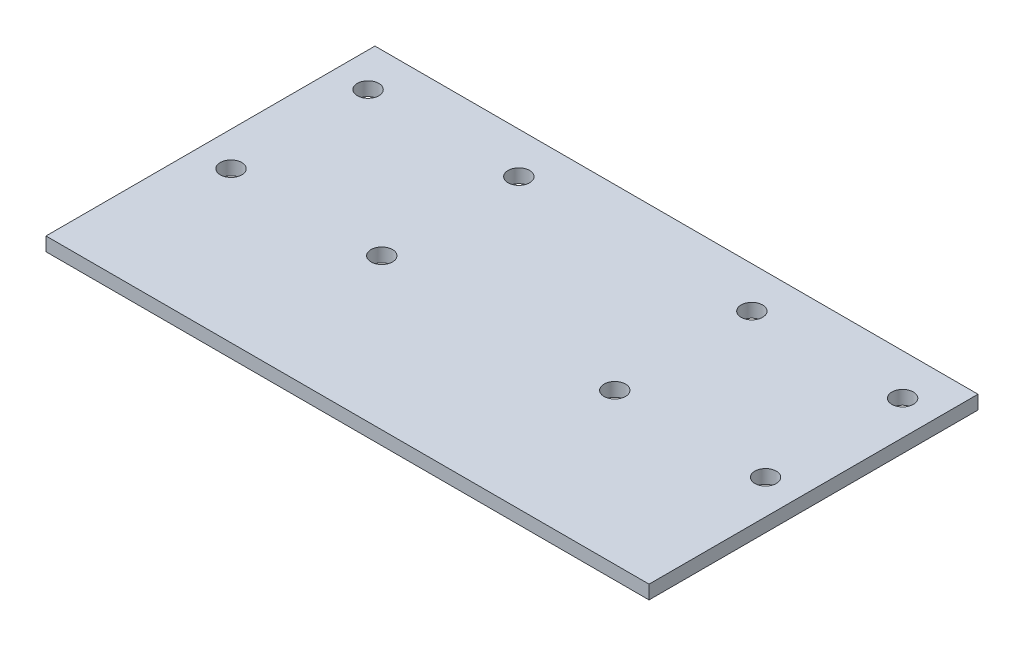
ISO-10303-21;
HEADER;
FILE_DESCRIPTION(('STEP AP214'),'2;1');
FILE_NAME('part.step','',(''),(''),'','','');
FILE_SCHEMA(('AUTOMOTIVE_DESIGN { 1 0 10303 214 1 1 1 1 }'));
ENDSEC;
DATA;
#1=APPLICATION_CONTEXT('core data for automotive mechanical design processes');
#2=APPLICATION_PROTOCOL_DEFINITION('international standard','automotive_design',2000,#1);
#3=PRODUCT_CONTEXT('',#1,'mechanical');
#4=PRODUCT('Part','Part','',(#3));
#5=PRODUCT_RELATED_PRODUCT_CATEGORY('part','',(#4));
#6=PRODUCT_DEFINITION_FORMATION('','',#4);
#7=PRODUCT_DEFINITION_CONTEXT('part definition',#1,'design');
#8=PRODUCT_DEFINITION('design','',#6,#7);
#9=PRODUCT_DEFINITION_SHAPE('','',#8);
#10=(LENGTH_UNIT() NAMED_UNIT(*) SI_UNIT(.MILLI.,.METRE.));
#11=(NAMED_UNIT(*) PLANE_ANGLE_UNIT() SI_UNIT($,.RADIAN.));
#12=(NAMED_UNIT(*) SI_UNIT($,.STERADIAN.) SOLID_ANGLE_UNIT());
#13=UNCERTAINTY_MEASURE_WITH_UNIT(LENGTH_MEASURE(1.E-05),#10,'distance_accuracy_value','');
#14=(GEOMETRIC_REPRESENTATION_CONTEXT(3) GLOBAL_UNCERTAINTY_ASSIGNED_CONTEXT((#13)) GLOBAL_UNIT_ASSIGNED_CONTEXT((#10,
#11,#12)) REPRESENTATION_CONTEXT('',''));
#15=CARTESIAN_POINT('',(0.,0.,0.));
#16=DIRECTION('',(0.,0.,1.));
#17=DIRECTION('',(1.,0.,0.));
#18=AXIS2_PLACEMENT_3D('',#15,#16,#17);
#19=CARTESIAN_POINT('',(0.,3.175,0.));
#20=DIRECTION('',(0.,-1.,0.));
#21=DIRECTION('',(0.,0.,-1.));
#22=AXIS2_PLACEMENT_3D('',#19,#20,#21);
#23=PLANE('',#22);
#24=CARTESIAN_POINT('',(-61.9125,3.175,-28.575));
#25=DIRECTION('',(0.,1.,0.));
#26=DIRECTION('',(0.,0.,1.));
#27=AXIS2_PLACEMENT_3D('',#24,#25,#26);
#28=CIRCLE('',#27,2.4892);
#29=CARTESIAN_POINT('',(-61.9125,3.175,-26.0858));
#30=VERTEX_POINT('',#29);
#31=EDGE_CURVE('E173',#30,#30,#28,.T.);
#32=ORIENTED_EDGE('',*,*,#31,.F.);
#33=EDGE_LOOP('',(#32));
#34=FACE_BOUND('',#33,.T.);
#35=CARTESIAN_POINT('',(-61.9125,3.175,3.175));
#36=DIRECTION('',(0.,1.,0.));
#37=DIRECTION('',(0.,0.,1.));
#38=AXIS2_PLACEMENT_3D('',#35,#36,#37);
#39=CIRCLE('',#38,2.4892);
#40=CARTESIAN_POINT('',(-61.9125,3.175,5.66419999999999));
#41=VERTEX_POINT('',#40);
#42=EDGE_CURVE('E167',#41,#41,#39,.T.);
#43=ORIENTED_EDGE('',*,*,#42,.F.);
#44=EDGE_LOOP('',(#43));
#45=FACE_BOUND('',#44,.T.);
#46=CARTESIAN_POINT('',(-26.9875,3.175,3.175));
#47=DIRECTION('',(0.,1.,0.));
#48=DIRECTION('',(0.,0.,1.));
#49=AXIS2_PLACEMENT_3D('',#46,#47,#48);
#50=CIRCLE('',#49,2.4892);
#51=CARTESIAN_POINT('',(-26.9875,3.175,5.6642));
#52=VERTEX_POINT('',#51);
#53=EDGE_CURVE('E162',#52,#52,#50,.T.);
#54=ORIENTED_EDGE('',*,*,#53,.F.);
#55=EDGE_LOOP('',(#54));
#56=FACE_BOUND('',#55,.T.);
#57=CARTESIAN_POINT('',(-26.9875,3.175,-28.575));
#58=DIRECTION('',(0.,1.,0.));
#59=DIRECTION('',(0.,0.,1.));
#60=AXIS2_PLACEMENT_3D('',#57,#58,#59);
#61=CIRCLE('',#60,2.4892);
#62=CARTESIAN_POINT('',(-26.9875,3.175,-26.0858));
#63=VERTEX_POINT('',#62);
#64=EDGE_CURVE('E154',#63,#63,#61,.T.);
#65=ORIENTED_EDGE('',*,*,#64,.F.);
#66=EDGE_LOOP('',(#65));
#67=FACE_BOUND('',#66,.T.);
#68=CARTESIAN_POINT('',(26.9875,3.175,-28.575));
#69=DIRECTION('',(0.,1.,0.));
#70=DIRECTION('',(0.,0.,1.));
#71=AXIS2_PLACEMENT_3D('',#68,#69,#70);
#72=CIRCLE('',#71,2.4892);
#73=CARTESIAN_POINT('',(26.9875,3.175,-26.0858));
#74=VERTEX_POINT('',#73);
#75=EDGE_CURVE('E147',#74,#74,#72,.T.);
#76=ORIENTED_EDGE('',*,*,#75,.F.);
#77=EDGE_LOOP('',(#76));
#78=FACE_BOUND('',#77,.T.);
#79=CARTESIAN_POINT('',(61.9125,3.175,-28.575));
#80=DIRECTION('',(0.,1.,0.));
#81=DIRECTION('',(0.,0.,1.));
#82=AXIS2_PLACEMENT_3D('',#79,#80,#81);
#83=CIRCLE('',#82,2.4892);
#84=CARTESIAN_POINT('',(61.9125,3.175,-26.0858));
#85=VERTEX_POINT('',#84);
#86=EDGE_CURVE('E136',#85,#85,#83,.T.);
#87=ORIENTED_EDGE('',*,*,#86,.F.);
#88=EDGE_LOOP('',(#87));
#89=FACE_BOUND('',#88,.T.);
#90=CARTESIAN_POINT('',(26.9875,3.175,3.175));
#91=DIRECTION('',(0.,1.,0.));
#92=DIRECTION('',(0.,0.,1.));
#93=AXIS2_PLACEMENT_3D('',#90,#91,#92);
#94=CIRCLE('',#93,2.4892);
#95=CARTESIAN_POINT('',(26.9875,3.175,5.6642));
#96=VERTEX_POINT('',#95);
#97=EDGE_CURVE('E123',#96,#96,#94,.T.);
#98=ORIENTED_EDGE('',*,*,#97,.F.);
#99=EDGE_LOOP('',(#98));
#100=FACE_BOUND('',#99,.T.);
#101=DIRECTION('',(0.,0.,-1.));
#102=VECTOR('',#101,1.);
#103=CARTESIAN_POINT('',(69.85,3.175,38.1));
#104=LINE('',#103,#102);
#105=CARTESIAN_POINT('',(69.85,3.175,38.1));
#106=VERTEX_POINT('',#105);
#107=CARTESIAN_POINT('',(69.85,3.175,-38.1));
#108=VERTEX_POINT('',#107);
#109=EDGE_CURVE('E92',#106,#108,#104,.T.);
#110=ORIENTED_EDGE('',*,*,#109,.T.);
#111=DIRECTION('',(-1.,0.,0.));
#112=VECTOR('',#111,1.);
#113=CARTESIAN_POINT('',(-69.85,3.175,-38.1));
#114=LINE('',#113,#112);
#115=CARTESIAN_POINT('',(-69.85,3.175,-38.1));
#116=VERTEX_POINT('',#115);
#117=EDGE_CURVE('E87',#108,#116,#114,.T.);
#118=ORIENTED_EDGE('',*,*,#117,.T.);
#119=DIRECTION('',(0.,0.,1.));
#120=VECTOR('',#119,1.);
#121=CARTESIAN_POINT('',(-69.85,3.175,38.1));
#122=LINE('',#121,#120);
#123=CARTESIAN_POINT('',(-69.85,3.175,38.1));
#124=VERTEX_POINT('',#123);
#125=EDGE_CURVE('E90',#116,#124,#122,.T.);
#126=ORIENTED_EDGE('',*,*,#125,.T.);
#127=DIRECTION('',(1.,0.,0.));
#128=VECTOR('',#127,1.);
#129=CARTESIAN_POINT('',(-69.85,3.175,38.1));
#130=LINE('',#129,#128);
#131=EDGE_CURVE('E57',#124,#106,#130,.T.);
#132=ORIENTED_EDGE('',*,*,#131,.T.);
#133=EDGE_LOOP('',(#110,#118,#126,#132));
#134=FACE_BOUND('',#133,.T.);
#135=CARTESIAN_POINT('',(61.9125,3.175,3.175));
#136=DIRECTION('',(0.,1.,0.));
#137=DIRECTION('',(0.,0.,1.));
#138=AXIS2_PLACEMENT_3D('',#135,#136,#137);
#139=CIRCLE('',#138,2.4892);
#140=CARTESIAN_POINT('',(61.9125,3.175,5.66419999999999));
#141=VERTEX_POINT('',#140);
#142=EDGE_CURVE('E128',#141,#141,#139,.T.);
#143=ORIENTED_EDGE('',*,*,#142,.F.);
#144=EDGE_LOOP('',(#143));
#145=FACE_BOUND('',#144,.T.);
#146=ADVANCED_FACE('F38',(#34,#45,#56,#67,#78,#89,#100,#134,#145),#23,.F.);
#147=CARTESIAN_POINT('',(69.85,3.175,38.1));
#148=DIRECTION('',(-1.,0.,0.));
#149=DIRECTION('',(0.,0.,1.));
#150=AXIS2_PLACEMENT_3D('',#147,#148,#149);
#151=PLANE('',#150);
#152=DIRECTION('',(0.,0.,-1.));
#153=VECTOR('',#152,1.);
#154=CARTESIAN_POINT('',(69.85,0.,38.1));
#155=LINE('',#154,#153);
#156=CARTESIAN_POINT('',(69.85,0.,38.1));
#157=VERTEX_POINT('',#156);
#158=CARTESIAN_POINT('',(69.85,0.,-38.1));
#159=VERTEX_POINT('',#158);
#160=EDGE_CURVE('E122',#157,#159,#155,.T.);
#161=ORIENTED_EDGE('',*,*,#160,.T.);
#162=DIRECTION('',(0.,-1.,0.));
#163=VECTOR('',#162,1.);
#164=CARTESIAN_POINT('',(69.85,3.175,-38.1));
#165=LINE('',#164,#163);
#166=EDGE_CURVE('E12',#108,#159,#165,.T.);
#167=ORIENTED_EDGE('',*,*,#166,.F.);
#168=ORIENTED_EDGE('',*,*,#109,.F.);
#169=DIRECTION('',(0.,-1.,0.));
#170=VECTOR('',#169,1.);
#171=CARTESIAN_POINT('',(69.85,3.175,38.1));
#172=LINE('',#171,#170);
#173=EDGE_CURVE('E104',#106,#157,#172,.T.);
#174=ORIENTED_EDGE('',*,*,#173,.T.);
#175=EDGE_LOOP('',(#161,#167,#168,#174));
#176=FACE_BOUND('',#175,.T.);
#177=ADVANCED_FACE('F40',(#176),#151,.F.);
#178=CARTESIAN_POINT('',(-69.85,3.175,-38.1));
#179=DIRECTION('',(0.,0.,1.));
#180=DIRECTION('',(1.,0.,0.));
#181=AXIS2_PLACEMENT_3D('',#178,#179,#180);
#182=PLANE('',#181);
#183=DIRECTION('',(-1.,0.,0.));
#184=VECTOR('',#183,1.);
#185=CARTESIAN_POINT('',(-69.85,0.,-38.1));
#186=LINE('',#185,#184);
#187=CARTESIAN_POINT('',(-69.85,0.,-38.1));
#188=VERTEX_POINT('',#187);
#189=EDGE_CURVE('E97',#159,#188,#186,.T.);
#190=ORIENTED_EDGE('',*,*,#189,.T.);
#191=DIRECTION('',(0.,-1.,0.));
#192=VECTOR('',#191,1.);
#193=CARTESIAN_POINT('',(-69.85,3.175,-38.1));
#194=LINE('',#193,#192);
#195=EDGE_CURVE('E48',#116,#188,#194,.T.);
#196=ORIENTED_EDGE('',*,*,#195,.F.);
#197=ORIENTED_EDGE('',*,*,#117,.F.);
#198=ORIENTED_EDGE('',*,*,#166,.T.);
#199=EDGE_LOOP('',(#190,#196,#197,#198));
#200=FACE_BOUND('',#199,.T.);
#201=ADVANCED_FACE('F96',(#200),#182,.F.);
#202=CARTESIAN_POINT('',(-69.85,3.175,38.1));
#203=DIRECTION('',(1.,0.,0.));
#204=DIRECTION('',(0.,0.,-1.));
#205=AXIS2_PLACEMENT_3D('',#202,#203,#204);
#206=PLANE('',#205);
#207=DIRECTION('',(0.,0.,1.));
#208=VECTOR('',#207,1.);
#209=CARTESIAN_POINT('',(-69.85,0.,38.1));
#210=LINE('',#209,#208);
#211=CARTESIAN_POINT('',(-69.85,0.,38.1));
#212=VERTEX_POINT('',#211);
#213=EDGE_CURVE('E74',#188,#212,#210,.T.);
#214=ORIENTED_EDGE('',*,*,#213,.T.);
#215=DIRECTION('',(0.,-1.,0.));
#216=VECTOR('',#215,1.);
#217=CARTESIAN_POINT('',(-69.85,3.175,38.1));
#218=LINE('',#217,#216);
#219=EDGE_CURVE('E98',#124,#212,#218,.T.);
#220=ORIENTED_EDGE('',*,*,#219,.F.);
#221=ORIENTED_EDGE('',*,*,#125,.F.);
#222=ORIENTED_EDGE('',*,*,#195,.T.);
#223=EDGE_LOOP('',(#214,#220,#221,#222));
#224=FACE_BOUND('',#223,.T.);
#225=ADVANCED_FACE('F100',(#224),#206,.F.);
#226=CARTESIAN_POINT('',(-69.85,3.175,38.1));
#227=DIRECTION('',(0.,0.,-1.));
#228=DIRECTION('',(-1.,0.,0.));
#229=AXIS2_PLACEMENT_3D('',#226,#227,#228);
#230=PLANE('',#229);
#231=DIRECTION('',(1.,0.,0.));
#232=VECTOR('',#231,1.);
#233=CARTESIAN_POINT('',(-69.85,0.,38.1));
#234=LINE('',#233,#232);
#235=EDGE_CURVE('E80',#212,#157,#234,.T.);
#236=ORIENTED_EDGE('',*,*,#235,.T.);
#237=ORIENTED_EDGE('',*,*,#173,.F.);
#238=ORIENTED_EDGE('',*,*,#131,.F.);
#239=ORIENTED_EDGE('',*,*,#219,.T.);
#240=EDGE_LOOP('',(#236,#237,#238,#239));
#241=FACE_BOUND('',#240,.T.);
#242=ADVANCED_FACE('F194',(#241),#230,.F.);
#243=CARTESIAN_POINT('',(0.,0.,0.));
#244=DIRECTION('',(0.,-1.,0.));
#245=DIRECTION('',(0.,0.,-1.));
#246=AXIS2_PLACEMENT_3D('',#243,#244,#245);
#247=PLANE('',#246);
#248=CARTESIAN_POINT('',(-61.9125,0.,-28.575));
#249=DIRECTION('',(0.,-1.,0.));
#250=DIRECTION('',(0.,0.,-1.));
#251=AXIS2_PLACEMENT_3D('',#248,#249,#250);
#252=CIRCLE('',#251,2.4892);
#253=CARTESIAN_POINT('',(-61.9125,0.,-31.0642));
#254=VERTEX_POINT('',#253);
#255=EDGE_CURVE('E177',#254,#254,#252,.T.);
#256=ORIENTED_EDGE('',*,*,#255,.F.);
#257=EDGE_LOOP('',(#256));
#258=FACE_BOUND('',#257,.T.);
#259=CARTESIAN_POINT('',(-61.9125,0.,3.175));
#260=DIRECTION('',(0.,-1.,0.));
#261=DIRECTION('',(0.,0.,-1.));
#262=AXIS2_PLACEMENT_3D('',#259,#260,#261);
#263=CIRCLE('',#262,2.4892);
#264=CARTESIAN_POINT('',(-61.9125,0.,0.6858));
#265=VERTEX_POINT('',#264);
#266=EDGE_CURVE('E42',#265,#265,#263,.T.);
#267=ORIENTED_EDGE('',*,*,#266,.F.);
#268=EDGE_LOOP('',(#267));
#269=FACE_BOUND('',#268,.T.);
#270=CARTESIAN_POINT('',(-26.9875,0.,3.175));
#271=DIRECTION('',(0.,-1.,0.));
#272=DIRECTION('',(0.,0.,-1.));
#273=AXIS2_PLACEMENT_3D('',#270,#271,#272);
#274=CIRCLE('',#273,2.4892);
#275=CARTESIAN_POINT('',(-26.9875,0.,0.685799999999999));
#276=VERTEX_POINT('',#275);
#277=EDGE_CURVE('E159',#276,#276,#274,.T.);
#278=ORIENTED_EDGE('',*,*,#277,.F.);
#279=EDGE_LOOP('',(#278));
#280=FACE_BOUND('',#279,.T.);
#281=CARTESIAN_POINT('',(-26.9875,0.,-28.575));
#282=DIRECTION('',(0.,-1.,0.));
#283=DIRECTION('',(0.,0.,-1.));
#284=AXIS2_PLACEMENT_3D('',#281,#282,#283);
#285=CIRCLE('',#284,2.4892);
#286=CARTESIAN_POINT('',(-26.9875,0.,-31.0642));
#287=VERTEX_POINT('',#286);
#288=EDGE_CURVE('E152',#287,#287,#285,.T.);
#289=ORIENTED_EDGE('',*,*,#288,.F.);
#290=EDGE_LOOP('',(#289));
#291=FACE_BOUND('',#290,.T.);
#292=CARTESIAN_POINT('',(26.9875,0.,-28.575));
#293=DIRECTION('',(0.,-1.,0.));
#294=DIRECTION('',(0.,0.,-1.));
#295=AXIS2_PLACEMENT_3D('',#292,#293,#294);
#296=CIRCLE('',#295,2.4892);
#297=CARTESIAN_POINT('',(26.9875,0.,-31.0642));
#298=VERTEX_POINT('',#297);
#299=EDGE_CURVE('E141',#298,#298,#296,.T.);
#300=ORIENTED_EDGE('',*,*,#299,.F.);
#301=EDGE_LOOP('',(#300));
#302=FACE_BOUND('',#301,.T.);
#303=CARTESIAN_POINT('',(61.9125,0.,-28.575));
#304=DIRECTION('',(0.,-1.,0.));
#305=DIRECTION('',(0.,0.,-1.));
#306=AXIS2_PLACEMENT_3D('',#303,#304,#305);
#307=CIRCLE('',#306,2.4892);
#308=CARTESIAN_POINT('',(61.9125,0.,-31.0642));
#309=VERTEX_POINT('',#308);
#310=EDGE_CURVE('E133',#309,#309,#307,.T.);
#311=ORIENTED_EDGE('',*,*,#310,.F.);
#312=EDGE_LOOP('',(#311));
#313=FACE_BOUND('',#312,.T.);
#314=CARTESIAN_POINT('',(61.9125,0.,3.175));
#315=DIRECTION('',(0.,-1.,0.));
#316=DIRECTION('',(0.,0.,-1.));
#317=AXIS2_PLACEMENT_3D('',#314,#315,#316);
#318=CIRCLE('',#317,2.4892);
#319=CARTESIAN_POINT('',(61.9125,0.,0.6858));
#320=VERTEX_POINT('',#319);
#321=EDGE_CURVE('E127',#320,#320,#318,.T.);
#322=ORIENTED_EDGE('',*,*,#321,.F.);
#323=EDGE_LOOP('',(#322));
#324=FACE_BOUND('',#323,.T.);
#325=CARTESIAN_POINT('',(26.9875,0.,3.175));
#326=DIRECTION('',(0.,-1.,0.));
#327=DIRECTION('',(0.,0.,-1.));
#328=AXIS2_PLACEMENT_3D('',#325,#326,#327);
#329=CIRCLE('',#328,2.4892);
#330=CARTESIAN_POINT('',(26.9875,0.,0.685799999999999));
#331=VERTEX_POINT('',#330);
#332=EDGE_CURVE('E120',#331,#331,#329,.T.);
#333=ORIENTED_EDGE('',*,*,#332,.F.);
#334=EDGE_LOOP('',(#333));
#335=FACE_BOUND('',#334,.T.);
#336=ORIENTED_EDGE('',*,*,#160,.F.);
#337=ORIENTED_EDGE('',*,*,#235,.F.);
#338=ORIENTED_EDGE('',*,*,#213,.F.);
#339=ORIENTED_EDGE('',*,*,#189,.F.);
#340=EDGE_LOOP('',(#336,#337,#338,#339));
#341=FACE_BOUND('',#340,.T.);
#342=ADVANCED_FACE('F190',(#258,#269,#280,#291,#302,#313,#324,#335,#341),#247,.T.);
#343=CARTESIAN_POINT('',(26.9875,3.175,3.175));
#344=DIRECTION('',(0.,1.,0.));
#345=DIRECTION('',(0.,0.,1.));
#346=AXIS2_PLACEMENT_3D('',#343,#344,#345);
#347=CYLINDRICAL_SURFACE('',#346,2.4892);
#348=ORIENTED_EDGE('',*,*,#332,.T.);
#349=EDGE_LOOP('',(#348));
#350=FACE_BOUND('',#349,.T.);
#351=ORIENTED_EDGE('',*,*,#97,.T.);
#352=EDGE_LOOP('',(#351));
#353=FACE_BOUND('',#352,.T.);
#354=ADVANCED_FACE('F193',(#350,#353),#347,.F.);
#355=CARTESIAN_POINT('',(61.9125,3.175,3.175));
#356=DIRECTION('',(0.,1.,0.));
#357=DIRECTION('',(0.,0.,1.));
#358=AXIS2_PLACEMENT_3D('',#355,#356,#357);
#359=CYLINDRICAL_SURFACE('',#358,2.4892);
#360=ORIENTED_EDGE('',*,*,#321,.T.);
#361=EDGE_LOOP('',(#360));
#362=FACE_BOUND('',#361,.T.);
#363=ORIENTED_EDGE('',*,*,#142,.T.);
#364=EDGE_LOOP('',(#363));
#365=FACE_BOUND('',#364,.T.);
#366=ADVANCED_FACE('F220',(#362,#365),#359,.F.);
#367=CARTESIAN_POINT('',(61.9125,3.175,-28.575));
#368=DIRECTION('',(0.,1.,0.));
#369=DIRECTION('',(0.,0.,1.));
#370=AXIS2_PLACEMENT_3D('',#367,#368,#369);
#371=CYLINDRICAL_SURFACE('',#370,2.4892);
#372=ORIENTED_EDGE('',*,*,#310,.T.);
#373=EDGE_LOOP('',(#372));
#374=FACE_BOUND('',#373,.T.);
#375=ORIENTED_EDGE('',*,*,#86,.T.);
#376=EDGE_LOOP('',(#375));
#377=FACE_BOUND('',#376,.T.);
#378=ADVANCED_FACE('F223',(#374,#377),#371,.F.);
#379=CARTESIAN_POINT('',(26.9875,3.175,-28.575));
#380=DIRECTION('',(0.,1.,0.));
#381=DIRECTION('',(0.,0.,1.));
#382=AXIS2_PLACEMENT_3D('',#379,#380,#381);
#383=CYLINDRICAL_SURFACE('',#382,2.4892);
#384=ORIENTED_EDGE('',*,*,#299,.T.);
#385=EDGE_LOOP('',(#384));
#386=FACE_BOUND('',#385,.T.);
#387=ORIENTED_EDGE('',*,*,#75,.T.);
#388=EDGE_LOOP('',(#387));
#389=FACE_BOUND('',#388,.T.);
#390=ADVANCED_FACE('F272',(#386,#389),#383,.F.);
#391=CARTESIAN_POINT('',(-26.9875,3.175,-28.575));
#392=DIRECTION('',(0.,1.,0.));
#393=DIRECTION('',(0.,0.,1.));
#394=AXIS2_PLACEMENT_3D('',#391,#392,#393);
#395=CYLINDRICAL_SURFACE('',#394,2.4892);
#396=ORIENTED_EDGE('',*,*,#288,.T.);
#397=EDGE_LOOP('',(#396));
#398=FACE_BOUND('',#397,.T.);
#399=ORIENTED_EDGE('',*,*,#64,.T.);
#400=EDGE_LOOP('',(#399));
#401=FACE_BOUND('',#400,.T.);
#402=ADVANCED_FACE('F280',(#398,#401),#395,.F.);
#403=CARTESIAN_POINT('',(-26.9875,3.175,3.175));
#404=DIRECTION('',(0.,1.,0.));
#405=DIRECTION('',(0.,0.,1.));
#406=AXIS2_PLACEMENT_3D('',#403,#404,#405);
#407=CYLINDRICAL_SURFACE('',#406,2.4892);
#408=ORIENTED_EDGE('',*,*,#277,.T.);
#409=EDGE_LOOP('',(#408));
#410=FACE_BOUND('',#409,.T.);
#411=ORIENTED_EDGE('',*,*,#53,.T.);
#412=EDGE_LOOP('',(#411));
#413=FACE_BOUND('',#412,.T.);
#414=ADVANCED_FACE('F288',(#410,#413),#407,.F.);
#415=CARTESIAN_POINT('',(-61.9125,3.175,3.175));
#416=DIRECTION('',(0.,1.,0.));
#417=DIRECTION('',(0.,0.,1.));
#418=AXIS2_PLACEMENT_3D('',#415,#416,#417);
#419=CYLINDRICAL_SURFACE('',#418,2.4892);
#420=ORIENTED_EDGE('',*,*,#266,.T.);
#421=EDGE_LOOP('',(#420));
#422=FACE_BOUND('',#421,.T.);
#423=ORIENTED_EDGE('',*,*,#42,.T.);
#424=EDGE_LOOP('',(#423));
#425=FACE_BOUND('',#424,.T.);
#426=ADVANCED_FACE('F188',(#422,#425),#419,.F.);
#427=CARTESIAN_POINT('',(-61.9125,3.175,-28.575));
#428=DIRECTION('',(0.,1.,0.));
#429=DIRECTION('',(0.,0.,1.));
#430=AXIS2_PLACEMENT_3D('',#427,#428,#429);
#431=CYLINDRICAL_SURFACE('',#430,2.4892);
#432=ORIENTED_EDGE('',*,*,#255,.T.);
#433=EDGE_LOOP('',(#432));
#434=FACE_BOUND('',#433,.T.);
#435=ORIENTED_EDGE('',*,*,#31,.T.);
#436=EDGE_LOOP('',(#435));
#437=FACE_BOUND('',#436,.T.);
#438=ADVANCED_FACE('F303',(#434,#437),#431,.F.);
#439=CLOSED_SHELL('',(#146,#177,#201,#225,#242,#342,#354,#366,#378,#390,#402,#414,#426,#438));
#440=MANIFOLD_SOLID_BREP('B2',#439);
#441=ADVANCED_BREP_SHAPE_REPRESENTATION('',(#18,#440),#14);
#442=SHAPE_DEFINITION_REPRESENTATION(#9,#441);
ENDSEC;
END-ISO-10303-21;
